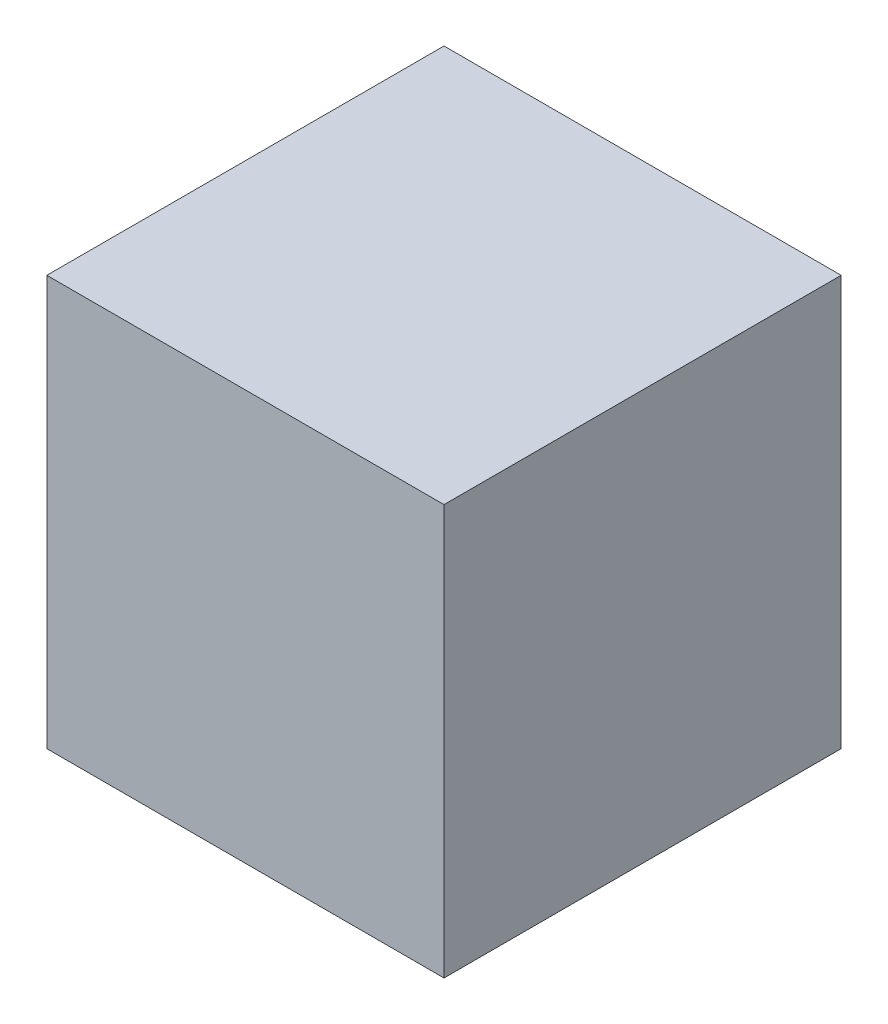
ISO-10303-21;
HEADER;
FILE_DESCRIPTION(('STEP AP214'),'2;1');
FILE_NAME('part.step','',(''),(''),'','','');
FILE_SCHEMA(('AUTOMOTIVE_DESIGN { 1 0 10303 214 1 1 1 1 }'));
ENDSEC;
DATA;
#1=APPLICATION_CONTEXT('core data for automotive mechanical design processes');
#2=APPLICATION_PROTOCOL_DEFINITION('international standard','automotive_design',2000,#1);
#3=PRODUCT_CONTEXT('',#1,'mechanical');
#4=PRODUCT('Part','Part','',(#3));
#5=PRODUCT_RELATED_PRODUCT_CATEGORY('part','',(#4));
#6=PRODUCT_DEFINITION_FORMATION('','',#4);
#7=PRODUCT_DEFINITION_CONTEXT('part definition',#1,'design');
#8=PRODUCT_DEFINITION('design','',#6,#7);
#9=PRODUCT_DEFINITION_SHAPE('','',#8);
#10=(LENGTH_UNIT() NAMED_UNIT(*) SI_UNIT(.MILLI.,.METRE.));
#11=(NAMED_UNIT(*) PLANE_ANGLE_UNIT() SI_UNIT($,.RADIAN.));
#12=(NAMED_UNIT(*) SI_UNIT($,.STERADIAN.) SOLID_ANGLE_UNIT());
#13=UNCERTAINTY_MEASURE_WITH_UNIT(LENGTH_MEASURE(1.E-05),#10,'distance_accuracy_value','');
#14=(GEOMETRIC_REPRESENTATION_CONTEXT(3) GLOBAL_UNCERTAINTY_ASSIGNED_CONTEXT((#13)) GLOBAL_UNIT_ASSIGNED_CONTEXT((#10,
#11,#12)) REPRESENTATION_CONTEXT('',''));
#15=CARTESIAN_POINT('',(0.,0.,0.));
#16=DIRECTION('',(0.,0.,1.));
#17=DIRECTION('',(1.,0.,0.));
#18=AXIS2_PLACEMENT_3D('',#15,#16,#17);
#19=CARTESIAN_POINT('',(15.5,32.,-15.5));
#20=DIRECTION('',(-1.,0.,0.));
#21=DIRECTION('',(0.,0.,1.));
#22=AXIS2_PLACEMENT_3D('',#19,#20,#21);
#23=PLANE('',#22);
#24=DIRECTION('',(0.,0.,-1.));
#25=VECTOR('',#24,1.);
#26=CARTESIAN_POINT('',(15.5,0.,-15.5));
#27=LINE('',#26,#25);
#28=CARTESIAN_POINT('',(15.5,0.,15.5));
#29=VERTEX_POINT('',#28);
#30=CARTESIAN_POINT('',(15.5,0.,-15.5));
#31=VERTEX_POINT('',#30);
#32=EDGE_CURVE('E100',#29,#31,#27,.T.);
#33=ORIENTED_EDGE('',*,*,#32,.T.);
#34=DIRECTION('',(0.,-1.,0.));
#35=VECTOR('',#34,1.);
#36=CARTESIAN_POINT('',(15.5,32.,-15.5));
#37=LINE('',#36,#35);
#38=CARTESIAN_POINT('',(15.5,32.,-15.5));
#39=VERTEX_POINT('',#38);
#40=EDGE_CURVE('E11',#39,#31,#37,.T.);
#41=ORIENTED_EDGE('',*,*,#40,.F.);
#42=DIRECTION('',(0.,0.,-1.));
#43=VECTOR('',#42,1.);
#44=CARTESIAN_POINT('',(15.5,32.,-15.5));
#45=LINE('',#44,#43);
#46=CARTESIAN_POINT('',(15.5,32.,15.5));
#47=VERTEX_POINT('',#46);
#48=EDGE_CURVE('E88',#47,#39,#45,.T.);
#49=ORIENTED_EDGE('',*,*,#48,.F.);
#50=DIRECTION('',(0.,-1.,0.));
#51=VECTOR('',#50,1.);
#52=CARTESIAN_POINT('',(15.5,32.,15.5));
#53=LINE('',#52,#51);
#54=EDGE_CURVE('E96',#47,#29,#53,.T.);
#55=ORIENTED_EDGE('',*,*,#54,.T.);
#56=EDGE_LOOP('',(#33,#41,#49,#55));
#57=FACE_BOUND('',#56,.T.);
#58=ADVANCED_FACE('F37',(#57),#23,.F.);
#59=CARTESIAN_POINT('',(-15.5,32.,-15.5));
#60=DIRECTION('',(0.,0.,1.));
#61=DIRECTION('',(1.,0.,0.));
#62=AXIS2_PLACEMENT_3D('',#59,#60,#61);
#63=PLANE('',#62);
#64=DIRECTION('',(-1.,0.,0.));
#65=VECTOR('',#64,1.);
#66=CARTESIAN_POINT('',(-15.5,0.,-15.5));
#67=LINE('',#66,#65);
#68=CARTESIAN_POINT('',(-15.5,0.,-15.5));
#69=VERTEX_POINT('',#68);
#70=EDGE_CURVE('E92',#31,#69,#67,.T.);
#71=ORIENTED_EDGE('',*,*,#70,.T.);
#72=DIRECTION('',(0.,-1.,0.));
#73=VECTOR('',#72,1.);
#74=CARTESIAN_POINT('',(-15.5,32.,-15.5));
#75=LINE('',#74,#73);
#76=CARTESIAN_POINT('',(-15.5,32.,-15.5));
#77=VERTEX_POINT('',#76);
#78=EDGE_CURVE('E45',#77,#69,#75,.T.);
#79=ORIENTED_EDGE('',*,*,#78,.F.);
#80=DIRECTION('',(-1.,0.,0.));
#81=VECTOR('',#80,1.);
#82=CARTESIAN_POINT('',(-15.5,32.,-15.5));
#83=LINE('',#82,#81);
#84=EDGE_CURVE('E83',#39,#77,#83,.T.);
#85=ORIENTED_EDGE('',*,*,#84,.F.);
#86=ORIENTED_EDGE('',*,*,#40,.T.);
#87=EDGE_LOOP('',(#71,#79,#85,#86));
#88=FACE_BOUND('',#87,.T.);
#89=ADVANCED_FACE('F91',(#88),#63,.F.);
#90=CARTESIAN_POINT('',(-15.5,32.,-15.5));
#91=DIRECTION('',(1.,0.,0.));
#92=DIRECTION('',(0.,0.,-1.));
#93=AXIS2_PLACEMENT_3D('',#90,#91,#92);
#94=PLANE('',#93);
#95=DIRECTION('',(0.,0.,1.));
#96=VECTOR('',#95,1.);
#97=CARTESIAN_POINT('',(-15.5,0.,-15.5));
#98=LINE('',#97,#96);
#99=CARTESIAN_POINT('',(-15.5,0.,15.5));
#100=VERTEX_POINT('',#99);
#101=EDGE_CURVE('E70',#69,#100,#98,.T.);
#102=ORIENTED_EDGE('',*,*,#101,.T.);
#103=DIRECTION('',(0.,-1.,0.));
#104=VECTOR('',#103,1.);
#105=CARTESIAN_POINT('',(-15.5,32.,15.5));
#106=LINE('',#105,#104);
#107=CARTESIAN_POINT('',(-15.5,32.,15.5));
#108=VERTEX_POINT('',#107);
#109=EDGE_CURVE('E93',#108,#100,#106,.T.);
#110=ORIENTED_EDGE('',*,*,#109,.F.);
#111=DIRECTION('',(0.,0.,1.));
#112=VECTOR('',#111,1.);
#113=CARTESIAN_POINT('',(-15.5,32.,-15.5));
#114=LINE('',#113,#112);
#115=EDGE_CURVE('E86',#77,#108,#114,.T.);
#116=ORIENTED_EDGE('',*,*,#115,.F.);
#117=ORIENTED_EDGE('',*,*,#78,.T.);
#118=EDGE_LOOP('',(#102,#110,#116,#117));
#119=FACE_BOUND('',#118,.T.);
#120=ADVANCED_FACE('F94',(#119),#94,.F.);
#121=CARTESIAN_POINT('',(-15.5,32.,15.5));
#122=DIRECTION('',(0.,0.,-1.));
#123=DIRECTION('',(-1.,0.,0.));
#124=AXIS2_PLACEMENT_3D('',#121,#122,#123);
#125=PLANE('',#124);
#126=DIRECTION('',(1.,0.,0.));
#127=VECTOR('',#126,1.);
#128=CARTESIAN_POINT('',(-15.5,0.,15.5));
#129=LINE('',#128,#127);
#130=EDGE_CURVE('E76',#100,#29,#129,.T.);
#131=ORIENTED_EDGE('',*,*,#130,.T.);
#132=ORIENTED_EDGE('',*,*,#54,.F.);
#133=DIRECTION('',(1.,0.,0.));
#134=VECTOR('',#133,1.);
#135=CARTESIAN_POINT('',(-15.5,32.,15.5));
#136=LINE('',#135,#134);
#137=EDGE_CURVE('E53',#108,#47,#136,.T.);
#138=ORIENTED_EDGE('',*,*,#137,.F.);
#139=ORIENTED_EDGE('',*,*,#109,.T.);
#140=EDGE_LOOP('',(#131,#132,#138,#139));
#141=FACE_BOUND('',#140,.T.);
#142=ADVANCED_FACE('F107',(#141),#125,.F.);
#143=CARTESIAN_POINT('',(0.,32.,0.));
#144=DIRECTION('',(0.,1.,0.));
#145=DIRECTION('',(0.,0.,1.));
#146=AXIS2_PLACEMENT_3D('',#143,#144,#145);
#147=PLANE('',#146);
#148=ORIENTED_EDGE('',*,*,#48,.T.);
#149=ORIENTED_EDGE('',*,*,#84,.T.);
#150=ORIENTED_EDGE('',*,*,#115,.T.);
#151=ORIENTED_EDGE('',*,*,#137,.T.);
#152=EDGE_LOOP('',(#148,#149,#150,#151));
#153=FACE_BOUND('',#152,.T.);
#154=ADVANCED_FACE('F84',(#153),#147,.T.);
#155=CARTESIAN_POINT('',(0.,0.,0.));
#156=DIRECTION('',(0.,1.,0.));
#157=DIRECTION('',(0.,0.,1.));
#158=AXIS2_PLACEMENT_3D('',#155,#156,#157);
#159=PLANE('',#158);
#160=ORIENTED_EDGE('',*,*,#32,.F.);
#161=ORIENTED_EDGE('',*,*,#130,.F.);
#162=ORIENTED_EDGE('',*,*,#101,.F.);
#163=ORIENTED_EDGE('',*,*,#70,.F.);
#164=EDGE_LOOP('',(#160,#161,#162,#163));
#165=FACE_BOUND('',#164,.T.);
#166=ADVANCED_FACE('F110',(#165),#159,.F.);
#167=CLOSED_SHELL('',(#58,#89,#120,#142,#154,#166));
#168=MANIFOLD_SOLID_BREP('B2',#167);
#169=ADVANCED_BREP_SHAPE_REPRESENTATION('',(#18,#168),#14);
#170=SHAPE_DEFINITION_REPRESENTATION(#9,#169);
ENDSEC;
END-ISO-10303-21;
